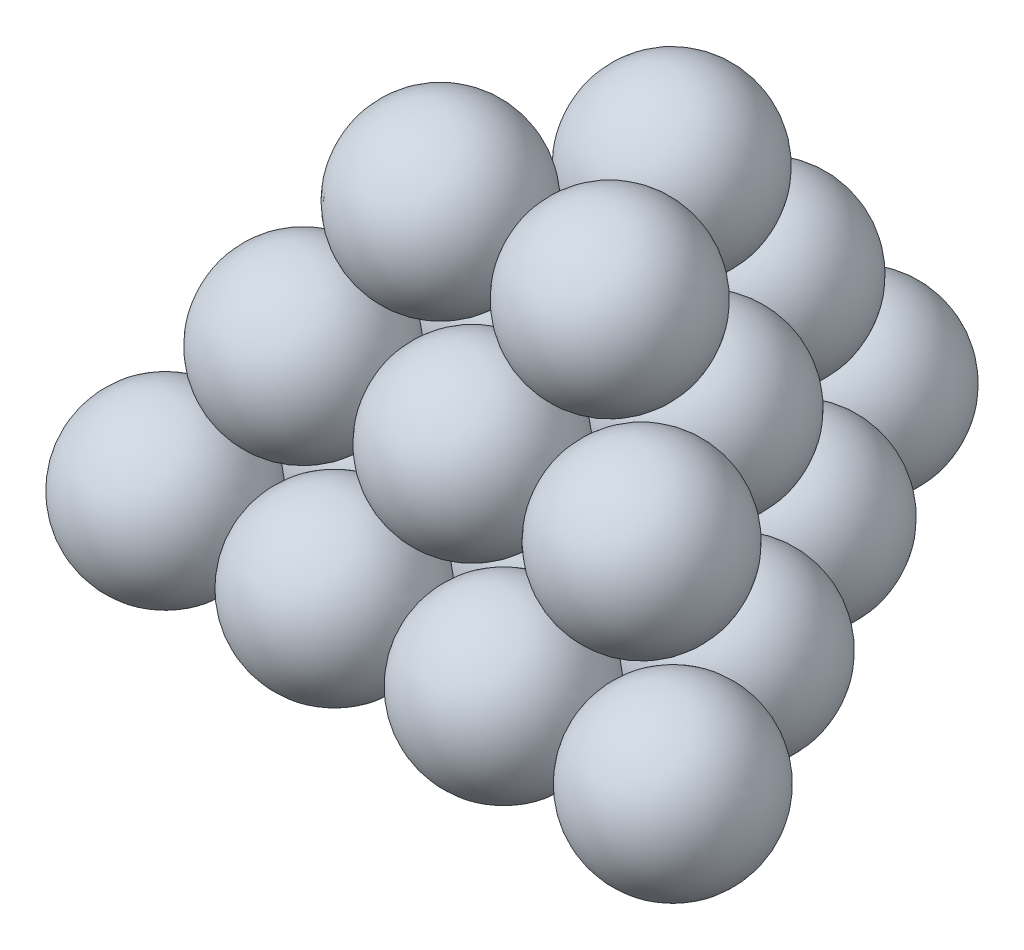
ISO-10303-21;
HEADER;
FILE_DESCRIPTION(('STEP AP214'),'2;1');
FILE_NAME('part.step','',(''),(''),'','','');
FILE_SCHEMA(('AUTOMOTIVE_DESIGN { 1 0 10303 214 1 1 1 1 }'));
ENDSEC;
DATA;
#1=APPLICATION_CONTEXT('core data for automotive mechanical design processes');
#2=APPLICATION_PROTOCOL_DEFINITION('international standard','automotive_design',2000,#1);
#3=PRODUCT_CONTEXT('',#1,'mechanical');
#4=PRODUCT('Part','Part','',(#3));
#5=PRODUCT_RELATED_PRODUCT_CATEGORY('part','',(#4));
#6=PRODUCT_DEFINITION_FORMATION('','',#4);
#7=PRODUCT_DEFINITION_CONTEXT('part definition',#1,'design');
#8=PRODUCT_DEFINITION('design','',#6,#7);
#9=PRODUCT_DEFINITION_SHAPE('','',#8);
#10=(LENGTH_UNIT() NAMED_UNIT(*) SI_UNIT(.MILLI.,.METRE.));
#11=(NAMED_UNIT(*) PLANE_ANGLE_UNIT() SI_UNIT($,.RADIAN.));
#12=(NAMED_UNIT(*) SI_UNIT($,.STERADIAN.) SOLID_ANGLE_UNIT());
#13=UNCERTAINTY_MEASURE_WITH_UNIT(LENGTH_MEASURE(1.E-05),#10,'distance_accuracy_value','');
#14=(GEOMETRIC_REPRESENTATION_CONTEXT(3) GLOBAL_UNCERTAINTY_ASSIGNED_CONTEXT((#13)) GLOBAL_UNIT_ASSIGNED_CONTEXT((#10,
#11,#12)) REPRESENTATION_CONTEXT('',''));
#15=CARTESIAN_POINT('',(0.,0.,0.));
#16=DIRECTION('',(0.,0.,1.));
#17=DIRECTION('',(1.,0.,0.));
#18=AXIS2_PLACEMENT_3D('',#15,#16,#17);
#19=CARTESIAN_POINT('',(90.0000000000066,100.,-89.5911930746948));
#20=DIRECTION('',(-1.,0.,0.));
#21=DIRECTION('',(0.,0.,-1.));
#22=AXIS2_PLACEMENT_3D('',#19,#20,#21);
#23=SPHERICAL_SURFACE('',#22,30.);
#24=CARTESIAN_POINT('',(60.0000000000066,100.,-89.5911930746948));
#25=VERTEX_POINT('',#24);
#26=VERTEX_LOOP('',#25);
#27=FACE_BOUND('',#26,.T.);
#28=ADVANCED_FACE('F39',(#27),#23,.T.);
#29=CLOSED_SHELL('',(#28));
#30=MANIFOLD_SOLID_BREP('B2',#29);
#31=CARTESIAN_POINT('',(120.000000000007,100.,-37.6296688476286));
#32=DIRECTION('',(-1.,0.,0.));
#33=DIRECTION('',(0.,0.,-1.));
#34=AXIS2_PLACEMENT_3D('',#31,#32,#33);
#35=SPHERICAL_SURFACE('',#34,30.);
#36=CARTESIAN_POINT('',(105.000000000007,100.,-63.6104309611617));
#37=VERTEX_POINT('',#36);
#38=VERTEX_LOOP('',#37);
#39=FACE_BOUND('',#38,.T.);
#40=ADVANCED_FACE('F59',(#39),#35,.T.);
#41=CLOSED_SHELL('',(#40));
#42=MANIFOLD_SOLID_BREP('B6',#41);
#43=CARTESIAN_POINT('',(60.0000000000069,100.,-37.6296688476286));
#44=DIRECTION('',(-1.,0.,0.));
#45=DIRECTION('',(0.,0.,1.));
#46=AXIS2_PLACEMENT_3D('',#43,#44,#45);
#47=SPHERICAL_SURFACE('',#46,30.);
#48=CARTESIAN_POINT('',(75.0000000000068,100.,-63.6104309611618));
#49=VERTEX_POINT('',#48);
#50=VERTEX_LOOP('',#49);
#51=FACE_BOUND('',#50,.T.);
#52=CARTESIAN_POINT('',(90.0000000000069,100.,-37.6296688476286));
#53=VERTEX_POINT('',#52);
#54=VERTEX_LOOP('',#53);
#55=FACE_BOUND('',#54,.T.);
#56=ADVANCED_FACE('F77',(#51,#55),#47,.T.);
#57=CLOSED_SHELL('',(#56));
#58=MANIFOLD_SOLID_BREP('B33',#57);
#59=CARTESIAN_POINT('',(150.000000000006,50.,-18.9380413613933));
#60=DIRECTION('',(-1.,0.,0.));
#61=DIRECTION('',(0.,0.,1.));
#62=AXIS2_PLACEMENT_3D('',#59,#60,#61);
#63=SPHERICAL_SURFACE('',#62,30.0000000000002);
#64=CARTESIAN_POINT('',(120.000000000006,50.,-18.9380413613933));
#65=VERTEX_POINT('',#64);
#66=VERTEX_LOOP('',#65);
#67=FACE_BOUND('',#66,.T.);
#68=ADVANCED_FACE('F101',(#67),#63,.T.);
#69=CLOSED_SHELL('',(#68));
#70=MANIFOLD_SOLID_BREP('B53',#69);
#71=CARTESIAN_POINT('',(90.0000000000066,50.,-18.9380413613924));
#72=DIRECTION('',(-1.,0.,0.));
#73=DIRECTION('',(0.,0.,-1.));
#74=AXIS2_PLACEMENT_3D('',#71,#72,#73);
#75=SPHERICAL_SURFACE('',#74,29.9999999999997);
#76=CARTESIAN_POINT('',(120.000000000006,50.,-18.9380413613928));
#77=VERTEX_POINT('',#76);
#78=VERTEX_LOOP('',#77);
#79=FACE_BOUND('',#78,.T.);
#80=ADVANCED_FACE('F121',(#79),#75,.T.);
#81=CLOSED_SHELL('',(#80));
#82=MANIFOLD_SOLID_BREP('B73',#81);
#83=CARTESIAN_POINT('',(30.0000000000066,50.,-18.9380413613924));
#84=DIRECTION('',(-1.,0.,0.));
#85=DIRECTION('',(0.,0.,-1.));
#86=AXIS2_PLACEMENT_3D('',#83,#84,#85);
#87=SPHERICAL_SURFACE('',#86,30.0000000000002);
#88=CARTESIAN_POINT('',(60.0000000000068,50.,-18.9380413613924));
#89=VERTEX_POINT('',#88);
#90=VERTEX_LOOP('',#89);
#91=FACE_BOUND('',#90,.T.);
#92=ADVANCED_FACE('F141',(#91),#87,.T.);
#93=CLOSED_SHELL('',(#92));
#94=MANIFOLD_SOLID_BREP('B95',#93);
#95=CARTESIAN_POINT('',(120.000000000006,50.,-70.8995655884585));
#96=DIRECTION('',(1.,0.,0.));
#97=DIRECTION('',(0.,0.,1.));
#98=AXIS2_PLACEMENT_3D('',#95,#96,#97);
#99=SPHERICAL_SURFACE('',#98,30.);
#100=CARTESIAN_POINT('',(135.000000000007,50.,-44.9188034749255));
#101=VERTEX_POINT('',#100);
#102=VERTEX_LOOP('',#101);
#103=FACE_BOUND('',#102,.T.);
#104=CARTESIAN_POINT('',(105.000000000006,50.,-44.9188034749253));
#105=VERTEX_POINT('',#104);
#106=VERTEX_LOOP('',#105);
#107=FACE_BOUND('',#106,.T.);
#108=ADVANCED_FACE('F161',(#103,#107),#99,.T.);
#109=CLOSED_SHELL('',(#108));
#110=MANIFOLD_SOLID_BREP('B115',#109);
#111=CARTESIAN_POINT('',(60.0000000000069,50.,-70.8995655884585));
#112=DIRECTION('',(1.,0.,0.));
#113=DIRECTION('',(0.,0.,1.));
#114=AXIS2_PLACEMENT_3D('',#111,#112,#113);
#115=SPHERICAL_SURFACE('',#114,29.9999999999997);
#116=CARTESIAN_POINT('',(75.0000000000067,50.,-44.9188034749256));
#117=VERTEX_POINT('',#116);
#118=VERTEX_LOOP('',#117);
#119=FACE_BOUND('',#118,.T.);
#120=CARTESIAN_POINT('',(45.0000000000069,50.,-44.9188034749257));
#121=VERTEX_POINT('',#120);
#122=VERTEX_LOOP('',#121);
#123=FACE_BOUND('',#122,.T.);
#124=CARTESIAN_POINT('',(90.0000000000066,50.,-70.8995655884585));
#125=VERTEX_POINT('',#124);
#126=VERTEX_LOOP('',#125);
#127=FACE_BOUND('',#126,.T.);
#128=ADVANCED_FACE('F185',(#119,#123,#127),#115,.T.);
#129=CLOSED_SHELL('',(#128));
#130=MANIFOLD_SOLID_BREP('B135',#129);
#131=CARTESIAN_POINT('',(90.000000000005,50.,-122.861089815527));
#132=DIRECTION('',(-1.,0.,0.));
#133=DIRECTION('',(0.,0.,1.));
#134=AXIS2_PLACEMENT_3D('',#131,#132,#133);
#135=SPHERICAL_SURFACE('',#134,30.);
#136=CARTESIAN_POINT('',(105.000000000005,50.,-96.8803277019938));
#137=VERTEX_POINT('',#136);
#138=VERTEX_LOOP('',#137);
#139=FACE_BOUND('',#138,.T.);
#140=CARTESIAN_POINT('',(75.0000000000062,50.,-96.8803277019932));
#141=VERTEX_POINT('',#140);
#142=VERTEX_LOOP('',#141);
#143=FACE_BOUND('',#142,.T.);
#144=ADVANCED_FACE('F211',(#139,#143),#135,.T.);
#145=CLOSED_SHELL('',(#144));
#146=MANIFOLD_SOLID_BREP('B155',#145);
#147=CARTESIAN_POINT('',(90.0000000000122,0.,-51.9615242270657));
#148=DIRECTION('',(-1.,0.,0.));
#149=DIRECTION('',(0.,0.,-1.));
#150=AXIS2_PLACEMENT_3D('',#147,#148,#149);
#151=SPHERICAL_SURFACE('',#150,30.);
#152=CARTESIAN_POINT('',(60.0000000000122,0.,-51.9615242270657));
#153=VERTEX_POINT('',#152);
#154=VERTEX_LOOP('',#153);
#155=FACE_BOUND('',#154,.T.);
#156=ADVANCED_FACE('F233',(#155),#151,.T.);
#157=CLOSED_SHELL('',(#156));
#158=MANIFOLD_SOLID_BREP('B179',#157);
#159=CARTESIAN_POINT('',(90.0000000000066,0.,-155.884572681203));
#160=DIRECTION('',(-1.,0.,0.));
#161=DIRECTION('',(0.,0.,-1.));
#162=AXIS2_PLACEMENT_3D('',#159,#160,#161);
#163=SPHERICAL_SURFACE('',#162,30.);
#164=CARTESIAN_POINT('',(60.0000000000066,0.,-155.884572681203));
#165=VERTEX_POINT('',#164);
#166=VERTEX_LOOP('',#165);
#167=FACE_BOUND('',#166,.T.);
#168=ADVANCED_FACE('F253',(#167),#163,.T.);
#169=CLOSED_SHELL('',(#168));
#170=MANIFOLD_SOLID_BREP('B207',#169);
#171=CARTESIAN_POINT('',(150.000000000012,0.,-51.9615242270657));
#172=DIRECTION('',(-1.,0.,0.));
#173=DIRECTION('',(0.,0.,-1.));
#174=AXIS2_PLACEMENT_3D('',#171,#172,#173);
#175=SPHERICAL_SURFACE('',#174,30.);
#176=CARTESIAN_POINT('',(120.000000000012,0.,-51.9615242270657));
#177=VERTEX_POINT('',#176);
#178=VERTEX_LOOP('',#177);
#179=FACE_BOUND('',#178,.T.);
#180=ADVANCED_FACE('F273',(#179),#175,.T.);
#181=CLOSED_SHELL('',(#180));
#182=MANIFOLD_SOLID_BREP('B229',#181);
#183=CARTESIAN_POINT('',(29.9999999999999,0.,-51.9615242270664));
#184=DIRECTION('',(-1.,0.,0.));
#185=DIRECTION('',(0.,0.,1.));
#186=AXIS2_PLACEMENT_3D('',#183,#184,#185);
#187=SPHERICAL_SURFACE('',#186,30.);
#188=CARTESIAN_POINT('',(59.9999999999999,0.,-51.9615242270661));
#189=VERTEX_POINT('',#188);
#190=VERTEX_LOOP('',#189);
#191=FACE_BOUND('',#190,.T.);
#192=ADVANCED_FACE('F293',(#191),#187,.T.);
#193=CLOSED_SHELL('',(#192));
#194=MANIFOLD_SOLID_BREP('B247',#193);
#195=CARTESIAN_POINT('',(120.000000000009,0.,-103.923048454134));
#196=DIRECTION('',(-1.,0.,0.));
#197=DIRECTION('',(0.,0.,1.));
#198=AXIS2_PLACEMENT_3D('',#195,#196,#197);
#199=SPHERICAL_SURFACE('',#198,30.0000000000031);
#200=CARTESIAN_POINT('',(105.000000000009,0.,-77.9422863405976));
#201=VERTEX_POINT('',#200);
#202=VERTEX_LOOP('',#201);
#203=FACE_BOUND('',#202,.T.);
#204=CARTESIAN_POINT('',(105.000000000007,0.,-129.90381056767));
#205=VERTEX_POINT('',#204);
#206=VERTEX_LOOP('',#205);
#207=FACE_BOUND('',#206,.T.);
#208=CARTESIAN_POINT('',(135.000000000012,0.,-77.9422863405988));
#209=VERTEX_POINT('',#208);
#210=VERTEX_LOOP('',#209);
#211=FACE_BOUND('',#210,.T.);
#212=ADVANCED_FACE('F313',(#203,#207,#211),#199,.T.);
#213=CLOSED_SHELL('',(#212));
#214=MANIFOLD_SOLID_BREP('B267',#213);
#215=CARTESIAN_POINT('',(60.0000000000039,0.,-103.923048454134));
#216=DIRECTION('',(-1.,0.,0.));
#217=DIRECTION('',(0.,0.,-1.));
#218=AXIS2_PLACEMENT_3D('',#215,#216,#217);
#219=SPHERICAL_SURFACE('',#218,30.0000000000034);
#220=CARTESIAN_POINT('',(75.0000000000082,0.,-77.9422863405997));
#221=VERTEX_POINT('',#220);
#222=VERTEX_LOOP('',#221);
#223=FACE_BOUND('',#222,.T.);
#224=CARTESIAN_POINT('',(75.0000000000061,0.,-129.90381056767));
#225=VERTEX_POINT('',#224);
#226=VERTEX_LOOP('',#225);
#227=FACE_BOUND('',#226,.T.);
#228=CARTESIAN_POINT('',(45.000000000001,0.,-77.9422863405989));
#229=VERTEX_POINT('',#228);
#230=VERTEX_LOOP('',#229);
#231=FACE_BOUND('',#230,.T.);
#232=CARTESIAN_POINT('',(90.0000000000073,0.,-103.923048454134));
#233=VERTEX_POINT('',#232);
#234=VERTEX_LOOP('',#233);
#235=FACE_BOUND('',#234,.T.);
#236=ADVANCED_FACE('F341',(#223,#227,#231,#235),#219,.T.);
#237=CLOSED_SHELL('',(#236));
#238=MANIFOLD_SOLID_BREP('B287',#237);
#239=CARTESIAN_POINT('',(180.,0.,0.));
#240=DIRECTION('',(0.,1.,0.));
#241=DIRECTION('',(1.,0.,0.));
#242=AXIS2_PLACEMENT_3D('',#239,#240,#241);
#243=SPHERICAL_SURFACE('',#242,30.);
#244=CARTESIAN_POINT('',(165.000000000004,0.,-25.9807621135357));
#245=VERTEX_POINT('',#244);
#246=VERTEX_LOOP('',#245);
#247=FACE_BOUND('',#246,.T.);
#248=ADVANCED_FACE('F373',(#247),#243,.T.);
#249=CLOSED_SHELL('',(#248));
#250=MANIFOLD_SOLID_BREP('B307',#249);
#251=CARTESIAN_POINT('',(120.,0.,0.));
#252=DIRECTION('',(0.,1.,0.));
#253=DIRECTION('',(1.,0.,0.));
#254=AXIS2_PLACEMENT_3D('',#251,#252,#253);
#255=SPHERICAL_SURFACE('',#254,30.);
#256=CARTESIAN_POINT('',(105.000000000004,0.,-25.9807621135357));
#257=VERTEX_POINT('',#256);
#258=VERTEX_LOOP('',#257);
#259=FACE_BOUND('',#258,.T.);
#260=CARTESIAN_POINT('',(135.000000000005,0.,-25.9807621135304));
#261=VERTEX_POINT('',#260);
#262=VERTEX_LOOP('',#261);
#263=FACE_BOUND('',#262,.T.);
#264=CARTESIAN_POINT('',(150.,0.,0.));
#265=VERTEX_POINT('',#264);
#266=VERTEX_LOOP('',#265);
#267=FACE_BOUND('',#266,.T.);
#268=ADVANCED_FACE('F393',(#259,#263,#267),#255,.T.);
#269=CLOSED_SHELL('',(#268));
#270=MANIFOLD_SOLID_BREP('B335',#269);
#271=CARTESIAN_POINT('',(60.,0.,0.));
#272=DIRECTION('',(0.,1.,0.));
#273=DIRECTION('',(1.,0.,0.));
#274=AXIS2_PLACEMENT_3D('',#271,#272,#273);
#275=SPHERICAL_SURFACE('',#274,30.);
#276=CARTESIAN_POINT('',(75.0000000000047,0.,-25.9807621135304));
#277=VERTEX_POINT('',#276);
#278=VERTEX_LOOP('',#277);
#279=FACE_BOUND('',#278,.T.);
#280=CARTESIAN_POINT('',(45.,0.,-25.9807621135331));
#281=VERTEX_POINT('',#280);
#282=VERTEX_LOOP('',#281);
#283=FACE_BOUND('',#282,.T.);
#284=CARTESIAN_POINT('',(90.,0.,0.));
#285=VERTEX_POINT('',#284);
#286=VERTEX_LOOP('',#285);
#287=FACE_BOUND('',#286,.T.);
#288=ADVANCED_FACE('F420',(#279,#283,#287),#275,.T.);
#289=CLOSED_SHELL('',(#288));
#290=MANIFOLD_SOLID_BREP('B367',#289);
#291=CARTESIAN_POINT('',(0.,0.,0.));
#292=DIRECTION('',(0.,1.,0.));
#293=DIRECTION('',(1.,0.,0.));
#294=AXIS2_PLACEMENT_3D('',#291,#292,#293);
#295=SPHERICAL_SURFACE('',#294,30.);
#296=CARTESIAN_POINT('',(30.,0.,0.));
#297=VERTEX_POINT('',#296);
#298=VERTEX_LOOP('',#297);
#299=FACE_BOUND('',#298,.T.);
#300=CARTESIAN_POINT('',(14.9999999999999,0.,-25.9807621135332));
#301=VERTEX_POINT('',#300);
#302=VERTEX_LOOP('',#301);
#303=FACE_BOUND('',#302,.T.);
#304=ADVANCED_FACE('F440',(#299,#303),#295,.T.);
#305=CLOSED_SHELL('',(#304));
#306=MANIFOLD_SOLID_BREP('B387',#305);
#307=ADVANCED_BREP_SHAPE_REPRESENTATION('',(#18,#30,#42,#58,#70,#82,#94,#110,#130,#146,#158,
#170,#182,#194,#214,#238,#250,#270,#290,#306),#14);
#308=SHAPE_DEFINITION_REPRESENTATION(#9,#307);
ENDSEC;
END-ISO-10303-21;
